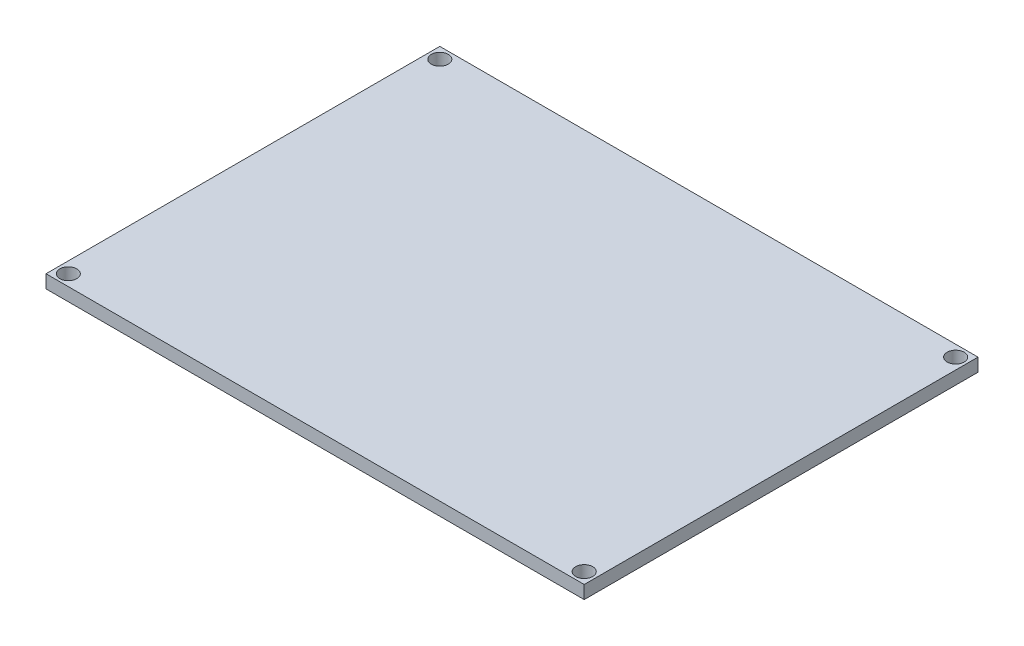
ISO-10303-21;
HEADER;
FILE_DESCRIPTION(('STEP AP214'),'2;1');
FILE_NAME('part.step','',(''),(''),'','','');
FILE_SCHEMA(('AUTOMOTIVE_DESIGN { 1 0 10303 214 1 1 1 1 }'));
ENDSEC;
DATA;
#1=APPLICATION_CONTEXT('core data for automotive mechanical design processes');
#2=APPLICATION_PROTOCOL_DEFINITION('international standard','automotive_design',2000,#1);
#3=PRODUCT_CONTEXT('',#1,'mechanical');
#4=PRODUCT('Part','Part','',(#3));
#5=PRODUCT_RELATED_PRODUCT_CATEGORY('part','',(#4));
#6=PRODUCT_DEFINITION_FORMATION('','',#4);
#7=PRODUCT_DEFINITION_CONTEXT('part definition',#1,'design');
#8=PRODUCT_DEFINITION('design','',#6,#7);
#9=PRODUCT_DEFINITION_SHAPE('','',#8);
#10=(LENGTH_UNIT() NAMED_UNIT(*) SI_UNIT(.MILLI.,.METRE.));
#11=(NAMED_UNIT(*) PLANE_ANGLE_UNIT() SI_UNIT($,.RADIAN.));
#12=(NAMED_UNIT(*) SI_UNIT($,.STERADIAN.) SOLID_ANGLE_UNIT());
#13=UNCERTAINTY_MEASURE_WITH_UNIT(LENGTH_MEASURE(1.E-05),#10,'distance_accuracy_value','');
#14=(GEOMETRIC_REPRESENTATION_CONTEXT(3) GLOBAL_UNCERTAINTY_ASSIGNED_CONTEXT((#13)) GLOBAL_UNIT_ASSIGNED_CONTEXT((#10,
#11,#12)) REPRESENTATION_CONTEXT('',''));
#15=CARTESIAN_POINT('',(0.,0.,0.));
#16=DIRECTION('',(0.,0.,1.));
#17=DIRECTION('',(1.,0.,0.));
#18=AXIS2_PLACEMENT_3D('',#15,#16,#17);
#19=CARTESIAN_POINT('',(0.,2.,0.));
#20=DIRECTION('',(0.,1.,0.));
#21=DIRECTION('',(0.,0.,1.));
#22=AXIS2_PLACEMENT_3D('',#19,#20,#21);
#23=PLANE('',#22);
#24=CARTESIAN_POINT('',(1.7,2.,1.7));
#25=DIRECTION('',(0.,1.,0.));
#26=DIRECTION('',(0.,0.,1.));
#27=AXIS2_PLACEMENT_3D('',#24,#25,#26);
#28=CIRCLE('',#27,1.3);
#29=CARTESIAN_POINT('',(1.7,2.,3.));
#30=VERTEX_POINT('',#29);
#31=EDGE_CURVE('E122',#30,#30,#28,.T.);
#32=ORIENTED_EDGE('',*,*,#31,.F.);
#33=EDGE_LOOP('',(#32));
#34=FACE_BOUND('',#33,.T.);
#35=CARTESIAN_POINT('',(80.3,2.,58.3));
#36=DIRECTION('',(0.,1.,0.));
#37=DIRECTION('',(0.,0.,1.));
#38=AXIS2_PLACEMENT_3D('',#35,#36,#37);
#39=CIRCLE('',#38,1.29999999999999);
#40=CARTESIAN_POINT('',(80.3,2.,59.6));
#41=VERTEX_POINT('',#40);
#42=EDGE_CURVE('E101',#41,#41,#39,.T.);
#43=ORIENTED_EDGE('',*,*,#42,.F.);
#44=EDGE_LOOP('',(#43));
#45=FACE_BOUND('',#44,.T.);
#46=DIRECTION('',(0.,0.,1.));
#47=VECTOR('',#46,1.);
#48=CARTESIAN_POINT('',(0.,2.,0.));
#49=LINE('',#48,#47);
#50=CARTESIAN_POINT('',(0.,2.,0.));
#51=VERTEX_POINT('',#50);
#52=CARTESIAN_POINT('',(0.,2.,60.));
#53=VERTEX_POINT('',#52);
#54=EDGE_CURVE('E86',#51,#53,#49,.T.);
#55=ORIENTED_EDGE('',*,*,#54,.T.);
#56=DIRECTION('',(1.,0.,0.));
#57=VECTOR('',#56,1.);
#58=CARTESIAN_POINT('',(0.,2.,60.));
#59=LINE('',#58,#57);
#60=CARTESIAN_POINT('',(82.,2.,60.));
#61=VERTEX_POINT('',#60);
#62=EDGE_CURVE('E81',#53,#61,#59,.T.);
#63=ORIENTED_EDGE('',*,*,#62,.T.);
#64=DIRECTION('',(0.,0.,-1.));
#65=VECTOR('',#64,1.);
#66=CARTESIAN_POINT('',(82.,2.,0.));
#67=LINE('',#66,#65);
#68=CARTESIAN_POINT('',(82.,2.,0.));
#69=VERTEX_POINT('',#68);
#70=EDGE_CURVE('E84',#61,#69,#67,.T.);
#71=ORIENTED_EDGE('',*,*,#70,.T.);
#72=DIRECTION('',(-1.,0.,0.));
#73=VECTOR('',#72,1.);
#74=CARTESIAN_POINT('',(0.,2.,0.));
#75=LINE('',#74,#73);
#76=EDGE_CURVE('E51',#69,#51,#75,.T.);
#77=ORIENTED_EDGE('',*,*,#76,.T.);
#78=EDGE_LOOP('',(#55,#63,#71,#77));
#79=FACE_BOUND('',#78,.T.);
#80=CARTESIAN_POINT('',(80.3,2.,1.7));
#81=DIRECTION('',(0.,1.,0.));
#82=DIRECTION('',(0.,0.,1.));
#83=AXIS2_PLACEMENT_3D('',#80,#81,#82);
#84=CIRCLE('',#83,1.29999999999999);
#85=CARTESIAN_POINT('',(80.3,2.,2.99999999999999));
#86=VERTEX_POINT('',#85);
#87=EDGE_CURVE('E116',#86,#86,#84,.T.);
#88=ORIENTED_EDGE('',*,*,#87,.F.);
#89=EDGE_LOOP('',(#88));
#90=FACE_BOUND('',#89,.T.);
#91=CARTESIAN_POINT('',(1.70000000000001,2.,58.3));
#92=DIRECTION('',(0.,1.,0.));
#93=DIRECTION('',(0.,0.,1.));
#94=AXIS2_PLACEMENT_3D('',#91,#92,#93);
#95=CIRCLE('',#94,1.3);
#96=CARTESIAN_POINT('',(1.70000000000001,2.,59.6));
#97=VERTEX_POINT('',#96);
#98=EDGE_CURVE('E128',#97,#97,#95,.T.);
#99=ORIENTED_EDGE('',*,*,#98,.F.);
#100=EDGE_LOOP('',(#99));
#101=FACE_BOUND('',#100,.T.);
#102=ADVANCED_FACE('F34',(#34,#45,#79,#90,#101),#23,.T.);
#103=CARTESIAN_POINT('',(0.,0.,0.));
#104=DIRECTION('',(0.,1.,0.));
#105=DIRECTION('',(0.,0.,1.));
#106=AXIS2_PLACEMENT_3D('',#103,#104,#105);
#107=PLANE('',#106);
#108=DIRECTION('',(0.,0.,1.));
#109=VECTOR('',#108,1.);
#110=CARTESIAN_POINT('',(0.,0.,0.));
#111=LINE('',#110,#109);
#112=CARTESIAN_POINT('',(0.,0.,0.));
#113=VERTEX_POINT('',#112);
#114=CARTESIAN_POINT('',(0.,0.,60.));
#115=VERTEX_POINT('',#114);
#116=EDGE_CURVE('E98',#113,#115,#111,.T.);
#117=ORIENTED_EDGE('',*,*,#116,.F.);
#118=DIRECTION('',(-1.,0.,0.));
#119=VECTOR('',#118,1.);
#120=CARTESIAN_POINT('',(0.,0.,0.));
#121=LINE('',#120,#119);
#122=CARTESIAN_POINT('',(82.,0.,0.));
#123=VERTEX_POINT('',#122);
#124=EDGE_CURVE('E74',#123,#113,#121,.T.);
#125=ORIENTED_EDGE('',*,*,#124,.F.);
#126=DIRECTION('',(0.,0.,-1.));
#127=VECTOR('',#126,1.);
#128=CARTESIAN_POINT('',(82.,0.,0.));
#129=LINE('',#128,#127);
#130=CARTESIAN_POINT('',(82.,0.,60.));
#131=VERTEX_POINT('',#130);
#132=EDGE_CURVE('E68',#131,#123,#129,.T.);
#133=ORIENTED_EDGE('',*,*,#132,.F.);
#134=DIRECTION('',(1.,0.,0.));
#135=VECTOR('',#134,1.);
#136=CARTESIAN_POINT('',(0.,0.,60.));
#137=LINE('',#136,#135);
#138=EDGE_CURVE('E90',#115,#131,#137,.T.);
#139=ORIENTED_EDGE('',*,*,#138,.F.);
#140=EDGE_LOOP('',(#117,#125,#133,#139));
#141=FACE_BOUND('',#140,.T.);
#142=CARTESIAN_POINT('',(80.3,0.,58.3));
#143=DIRECTION('',(0.,1.,0.));
#144=DIRECTION('',(0.,0.,1.));
#145=AXIS2_PLACEMENT_3D('',#142,#143,#144);
#146=CIRCLE('',#145,1.29999999999999);
#147=CARTESIAN_POINT('',(80.3,0.,59.6));
#148=VERTEX_POINT('',#147);
#149=EDGE_CURVE('E113',#148,#148,#146,.T.);
#150=ORIENTED_EDGE('',*,*,#149,.T.);
#151=EDGE_LOOP('',(#150));
#152=FACE_BOUND('',#151,.T.);
#153=CARTESIAN_POINT('',(80.3,0.,1.7));
#154=DIRECTION('',(0.,1.,0.));
#155=DIRECTION('',(0.,0.,1.));
#156=AXIS2_PLACEMENT_3D('',#153,#154,#155);
#157=CIRCLE('',#156,1.29999999999999);
#158=CARTESIAN_POINT('',(80.3,0.,2.99999999999999));
#159=VERTEX_POINT('',#158);
#160=EDGE_CURVE('E119',#159,#159,#157,.T.);
#161=ORIENTED_EDGE('',*,*,#160,.T.);
#162=EDGE_LOOP('',(#161));
#163=FACE_BOUND('',#162,.T.);
#164=CARTESIAN_POINT('',(1.7,0.,1.7));
#165=DIRECTION('',(0.,1.,0.));
#166=DIRECTION('',(0.,0.,1.));
#167=AXIS2_PLACEMENT_3D('',#164,#165,#166);
#168=CIRCLE('',#167,1.3);
#169=CARTESIAN_POINT('',(1.7,0.,3.));
#170=VERTEX_POINT('',#169);
#171=EDGE_CURVE('E125',#170,#170,#168,.T.);
#172=ORIENTED_EDGE('',*,*,#171,.T.);
#173=EDGE_LOOP('',(#172));
#174=FACE_BOUND('',#173,.T.);
#175=CARTESIAN_POINT('',(1.70000000000001,0.,58.3));
#176=DIRECTION('',(0.,1.,0.));
#177=DIRECTION('',(0.,0.,1.));
#178=AXIS2_PLACEMENT_3D('',#175,#176,#177);
#179=CIRCLE('',#178,1.3);
#180=CARTESIAN_POINT('',(1.70000000000001,0.,59.6));
#181=VERTEX_POINT('',#180);
#182=EDGE_CURVE('E131',#181,#181,#179,.T.);
#183=ORIENTED_EDGE('',*,*,#182,.T.);
#184=EDGE_LOOP('',(#183));
#185=FACE_BOUND('',#184,.T.);
#186=ADVANCED_FACE('F109',(#141,#152,#163,#174,#185),#107,.F.);
#187=CARTESIAN_POINT('',(0.,2.,0.));
#188=DIRECTION('',(1.,0.,0.));
#189=DIRECTION('',(0.,0.,-1.));
#190=AXIS2_PLACEMENT_3D('',#187,#188,#189);
#191=PLANE('',#190);
#192=ORIENTED_EDGE('',*,*,#116,.T.);
#193=DIRECTION('',(0.,-1.,0.));
#194=VECTOR('',#193,1.);
#195=CARTESIAN_POINT('',(0.,2.,60.));
#196=LINE('',#195,#194);
#197=EDGE_CURVE('E11',#53,#115,#196,.T.);
#198=ORIENTED_EDGE('',*,*,#197,.F.);
#199=ORIENTED_EDGE('',*,*,#54,.F.);
#200=DIRECTION('',(0.,-1.,0.));
#201=VECTOR('',#200,1.);
#202=CARTESIAN_POINT('',(0.,2.,0.));
#203=LINE('',#202,#201);
#204=EDGE_CURVE('E94',#51,#113,#203,.T.);
#205=ORIENTED_EDGE('',*,*,#204,.T.);
#206=EDGE_LOOP('',(#192,#198,#199,#205));
#207=FACE_BOUND('',#206,.T.);
#208=ADVANCED_FACE('F36',(#207),#191,.F.);
#209=CARTESIAN_POINT('',(0.,2.,60.));
#210=DIRECTION('',(0.,0.,-1.));
#211=DIRECTION('',(-1.,0.,0.));
#212=AXIS2_PLACEMENT_3D('',#209,#210,#211);
#213=PLANE('',#212);
#214=ORIENTED_EDGE('',*,*,#138,.T.);
#215=DIRECTION('',(0.,-1.,0.));
#216=VECTOR('',#215,1.);
#217=CARTESIAN_POINT('',(82.,2.,60.));
#218=LINE('',#217,#216);
#219=EDGE_CURVE('E43',#61,#131,#218,.T.);
#220=ORIENTED_EDGE('',*,*,#219,.F.);
#221=ORIENTED_EDGE('',*,*,#62,.F.);
#222=ORIENTED_EDGE('',*,*,#197,.T.);
#223=EDGE_LOOP('',(#214,#220,#221,#222));
#224=FACE_BOUND('',#223,.T.);
#225=ADVANCED_FACE('F89',(#224),#213,.F.);
#226=CARTESIAN_POINT('',(82.,2.,0.));
#227=DIRECTION('',(-1.,0.,0.));
#228=DIRECTION('',(0.,0.,1.));
#229=AXIS2_PLACEMENT_3D('',#226,#227,#228);
#230=PLANE('',#229);
#231=ORIENTED_EDGE('',*,*,#132,.T.);
#232=DIRECTION('',(0.,-1.,0.));
#233=VECTOR('',#232,1.);
#234=CARTESIAN_POINT('',(82.,2.,0.));
#235=LINE('',#234,#233);
#236=EDGE_CURVE('E91',#69,#123,#235,.T.);
#237=ORIENTED_EDGE('',*,*,#236,.F.);
#238=ORIENTED_EDGE('',*,*,#70,.F.);
#239=ORIENTED_EDGE('',*,*,#219,.T.);
#240=EDGE_LOOP('',(#231,#237,#238,#239));
#241=FACE_BOUND('',#240,.T.);
#242=ADVANCED_FACE('F92',(#241),#230,.F.);
#243=CARTESIAN_POINT('',(0.,2.,0.));
#244=DIRECTION('',(0.,0.,1.));
#245=DIRECTION('',(1.,0.,0.));
#246=AXIS2_PLACEMENT_3D('',#243,#244,#245);
#247=PLANE('',#246);
#248=ORIENTED_EDGE('',*,*,#124,.T.);
#249=ORIENTED_EDGE('',*,*,#204,.F.);
#250=ORIENTED_EDGE('',*,*,#76,.F.);
#251=ORIENTED_EDGE('',*,*,#236,.T.);
#252=EDGE_LOOP('',(#248,#249,#250,#251));
#253=FACE_BOUND('',#252,.T.);
#254=ADVANCED_FACE('F106',(#253),#247,.F.);
#255=CARTESIAN_POINT('',(80.3,2.,58.3));
#256=DIRECTION('',(0.,-1.,0.));
#257=DIRECTION('',(0.,0.,-1.));
#258=AXIS2_PLACEMENT_3D('',#255,#256,#257);
#259=CYLINDRICAL_SURFACE('',#258,1.29999999999999);
#260=ORIENTED_EDGE('',*,*,#42,.T.);
#261=EDGE_LOOP('',(#260));
#262=FACE_BOUND('',#261,.T.);
#263=ORIENTED_EDGE('',*,*,#149,.F.);
#264=EDGE_LOOP('',(#263));
#265=FACE_BOUND('',#264,.T.);
#266=ADVANCED_FACE('F150',(#262,#265),#259,.F.);
#267=CARTESIAN_POINT('',(80.3,2.,1.7));
#268=DIRECTION('',(0.,-1.,0.));
#269=DIRECTION('',(0.,0.,-1.));
#270=AXIS2_PLACEMENT_3D('',#267,#268,#269);
#271=CYLINDRICAL_SURFACE('',#270,1.29999999999999);
#272=ORIENTED_EDGE('',*,*,#87,.T.);
#273=EDGE_LOOP('',(#272));
#274=FACE_BOUND('',#273,.T.);
#275=ORIENTED_EDGE('',*,*,#160,.F.);
#276=EDGE_LOOP('',(#275));
#277=FACE_BOUND('',#276,.T.);
#278=ADVANCED_FACE('F196',(#274,#277),#271,.F.);
#279=CARTESIAN_POINT('',(1.7,2.,1.7));
#280=DIRECTION('',(0.,-1.,0.));
#281=DIRECTION('',(0.,0.,-1.));
#282=AXIS2_PLACEMENT_3D('',#279,#280,#281);
#283=CYLINDRICAL_SURFACE('',#282,1.3);
#284=ORIENTED_EDGE('',*,*,#31,.T.);
#285=EDGE_LOOP('',(#284));
#286=FACE_BOUND('',#285,.T.);
#287=ORIENTED_EDGE('',*,*,#171,.F.);
#288=EDGE_LOOP('',(#287));
#289=FACE_BOUND('',#288,.T.);
#290=ADVANCED_FACE('F204',(#286,#289),#283,.F.);
#291=CARTESIAN_POINT('',(1.70000000000001,2.,58.3));
#292=DIRECTION('',(0.,-1.,0.));
#293=DIRECTION('',(0.,0.,-1.));
#294=AXIS2_PLACEMENT_3D('',#291,#292,#293);
#295=CYLINDRICAL_SURFACE('',#294,1.3);
#296=ORIENTED_EDGE('',*,*,#98,.T.);
#297=EDGE_LOOP('',(#296));
#298=FACE_BOUND('',#297,.T.);
#299=ORIENTED_EDGE('',*,*,#182,.F.);
#300=EDGE_LOOP('',(#299));
#301=FACE_BOUND('',#300,.T.);
#302=ADVANCED_FACE('F137',(#298,#301),#295,.F.);
#303=CLOSED_SHELL('',(#102,#186,#208,#225,#242,#254,#266,#278,#290,#302));
#304=MANIFOLD_SOLID_BREP('B2',#303);
#305=ADVANCED_BREP_SHAPE_REPRESENTATION('',(#18,#304),#14);
#306=SHAPE_DEFINITION_REPRESENTATION(#9,#305);
ENDSEC;
END-ISO-10303-21;
